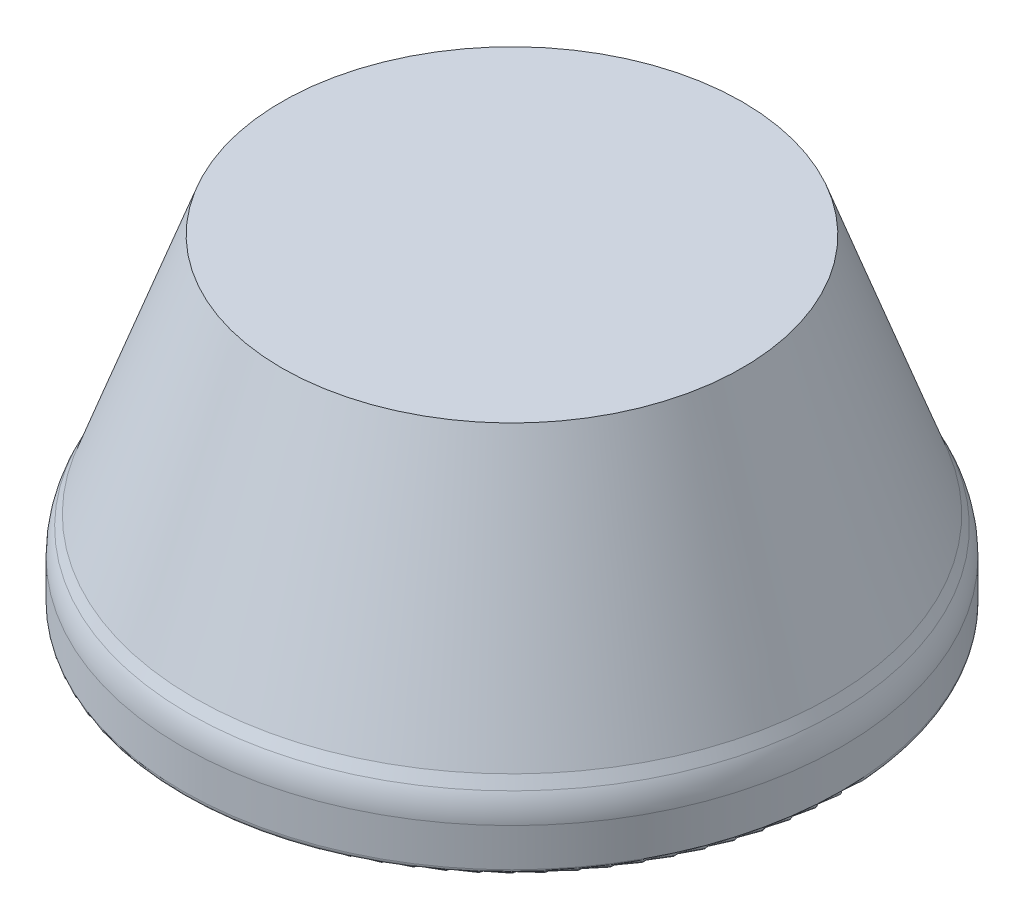
ISO-10303-21;
HEADER;
FILE_DESCRIPTION(('STEP AP214'),'2;1');
FILE_NAME('part.step','',(''),(''),'','','');
FILE_SCHEMA(('AUTOMOTIVE_DESIGN { 1 0 10303 214 1 1 1 1 }'));
ENDSEC;
DATA;
#1=APPLICATION_CONTEXT('core data for automotive mechanical design processes');
#2=APPLICATION_PROTOCOL_DEFINITION('international standard','automotive_design',2000,#1);
#3=PRODUCT_CONTEXT('',#1,'mechanical');
#4=PRODUCT('Part','Part','',(#3));
#5=PRODUCT_RELATED_PRODUCT_CATEGORY('part','',(#4));
#6=PRODUCT_DEFINITION_FORMATION('','',#4);
#7=PRODUCT_DEFINITION_CONTEXT('part definition',#1,'design');
#8=PRODUCT_DEFINITION('design','',#6,#7);
#9=PRODUCT_DEFINITION_SHAPE('','',#8);
#10=(LENGTH_UNIT() NAMED_UNIT(*) SI_UNIT(.MILLI.,.METRE.));
#11=(NAMED_UNIT(*) PLANE_ANGLE_UNIT() SI_UNIT($,.RADIAN.));
#12=(NAMED_UNIT(*) SI_UNIT($,.STERADIAN.) SOLID_ANGLE_UNIT());
#13=UNCERTAINTY_MEASURE_WITH_UNIT(LENGTH_MEASURE(1.E-05),#10,'distance_accuracy_value','');
#14=(GEOMETRIC_REPRESENTATION_CONTEXT(3) GLOBAL_UNCERTAINTY_ASSIGNED_CONTEXT((#13)) GLOBAL_UNIT_ASSIGNED_CONTEXT((#10,
#11,#12)) REPRESENTATION_CONTEXT('',''));
#15=CARTESIAN_POINT('',(0.,0.,0.));
#16=DIRECTION('',(0.,0.,1.));
#17=DIRECTION('',(1.,0.,0.));
#18=AXIS2_PLACEMENT_3D('',#15,#16,#17);
#19=CARTESIAN_POINT('',(0.,23.,0.));
#20=DIRECTION('',(0.,-1.,0.));
#21=DIRECTION('',(0.,0.,-1.));
#22=AXIS2_PLACEMENT_3D('',#19,#20,#21);
#23=CONICAL_SURFACE('',#22,20.,0.347240782896111);
#24=CARTESIAN_POINT('',(0.,2.,0.));
#25=DIRECTION('',(0.,1.,0.));
#26=DIRECTION('',(0.,0.,1.));
#27=AXIS2_PLACEMENT_3D('',#24,#25,#26);
#28=CIRCLE('',#27,27.6);
#29=CARTESIAN_POINT('',(0.,2.,27.6));
#30=VERTEX_POINT('',#29);
#31=EDGE_CURVE('E129',#30,#30,#28,.T.);
#32=ORIENTED_EDGE('',*,*,#31,.T.);
#33=EDGE_LOOP('',(#32));
#34=FACE_BOUND('',#33,.T.);
#35=CARTESIAN_POINT('',(0.,23.,0.));
#36=DIRECTION('',(0.,1.,0.));
#37=DIRECTION('',(0.,0.,1.));
#38=AXIS2_PLACEMENT_3D('',#35,#36,#37);
#39=CIRCLE('',#38,20.);
#40=CARTESIAN_POINT('',(0.,23.,20.));
#41=VERTEX_POINT('',#40);
#42=EDGE_CURVE('E63',#41,#41,#39,.T.);
#43=ORIENTED_EDGE('',*,*,#42,.F.);
#44=EDGE_LOOP('',(#43));
#45=FACE_BOUND('',#44,.T.);
#46=ADVANCED_FACE('F39',(#34,#45),#23,.T.);
#47=CARTESIAN_POINT('',(0.,23.,0.));
#48=DIRECTION('',(0.,1.,0.));
#49=DIRECTION('',(0.,0.,1.));
#50=AXIS2_PLACEMENT_3D('',#47,#48,#49);
#51=PLANE('',#50);
#52=ORIENTED_EDGE('',*,*,#42,.T.);
#53=EDGE_LOOP('',(#52));
#54=FACE_BOUND('',#53,.T.);
#55=ADVANCED_FACE('F82',(#54),#51,.T.);
#56=CARTESIAN_POINT('',(0.,0.,0.));
#57=DIRECTION('',(0.,1.,0.));
#58=DIRECTION('',(0.,0.,1.));
#59=AXIS2_PLACEMENT_3D('',#56,#57,#58);
#60=PLANE('',#59);
#61=CARTESIAN_POINT('',(0.,0.,0.));
#62=DIRECTION('',(0.,1.,0.));
#63=DIRECTION('',(0.,0.,1.));
#64=AXIS2_PLACEMENT_3D('',#61,#62,#63);
#65=CIRCLE('',#64,27.6);
#66=CARTESIAN_POINT('',(0.,0.,27.6));
#67=VERTEX_POINT('',#66);
#68=EDGE_CURVE('E66',#67,#67,#65,.T.);
#69=ORIENTED_EDGE('',*,*,#68,.F.);
#70=EDGE_LOOP('',(#69));
#71=FACE_BOUND('',#70,.T.);
#72=CARTESIAN_POINT('',(0.,0.,0.));
#73=DIRECTION('',(0.,1.,0.));
#74=DIRECTION('',(0.,0.,1.));
#75=AXIS2_PLACEMENT_3D('',#72,#73,#74);
#76=CIRCLE('',#75,26.);
#77=CARTESIAN_POINT('',(0.,0.,26.));
#78=VERTEX_POINT('',#77);
#79=EDGE_CURVE('E136',#78,#78,#76,.T.);
#80=ORIENTED_EDGE('',*,*,#79,.T.);
#81=EDGE_LOOP('',(#80));
#82=FACE_BOUND('',#81,.T.);
#83=ADVANCED_FACE('F88',(#71,#82),#60,.F.);
#84=CARTESIAN_POINT('',(0.,-5.,0.));
#85=DIRECTION('',(0.,1.,0.));
#86=DIRECTION('',(0.,0.,1.));
#87=AXIS2_PLACEMENT_3D('',#84,#85,#86);
#88=CYLINDRICAL_SURFACE('',#87,27.6);
#89=CARTESIAN_POINT('',(0.,-4.5,0.));
#90=DIRECTION('',(0.,1.,0.));
#91=DIRECTION('',(0.,0.,1.));
#92=AXIS2_PLACEMENT_3D('',#89,#90,#91);
#93=CIRCLE('',#92,27.6);
#94=CARTESIAN_POINT('',(0.,-4.5,27.6));
#95=VERTEX_POINT('',#94);
#96=EDGE_CURVE('E50',#95,#95,#93,.F.);
#97=ORIENTED_EDGE('',*,*,#96,.T.);
#98=EDGE_LOOP('',(#97));
#99=FACE_BOUND('',#98,.T.);
#100=ORIENTED_EDGE('',*,*,#68,.T.);
#101=EDGE_LOOP('',(#100));
#102=FACE_BOUND('',#101,.T.);
#103=ADVANCED_FACE('F84',(#99,#102),#88,.F.);
#104=CARTESIAN_POINT('',(0.,-5.,0.));
#105=DIRECTION('',(0.,1.,0.));
#106=DIRECTION('',(0.,0.,1.));
#107=AXIS2_PLACEMENT_3D('',#104,#105,#106);
#108=CYLINDRICAL_SURFACE('',#107,28.6);
#109=CARTESIAN_POINT('',(0.,-1.18033988749894,0.));
#110=DIRECTION('',(0.,-1.,0.));
#111=DIRECTION('',(0.,0.,-1.));
#112=AXIS2_PLACEMENT_3D('',#109,#110,#111);
#113=CIRCLE('',#112,28.6);
#114=CARTESIAN_POINT('',(0.,-1.18033988749894,-28.6));
#115=VERTEX_POINT('',#114);
#116=EDGE_CURVE('E11',#115,#115,#113,.T.);
#117=ORIENTED_EDGE('',*,*,#116,.T.);
#118=EDGE_LOOP('',(#117));
#119=FACE_BOUND('',#118,.T.);
#120=CARTESIAN_POINT('',(0.,-4.5,0.));
#121=DIRECTION('',(0.,1.,0.));
#122=DIRECTION('',(0.,0.,1.));
#123=AXIS2_PLACEMENT_3D('',#120,#121,#122);
#124=CIRCLE('',#123,28.6);
#125=CARTESIAN_POINT('',(0.,-4.5,28.6));
#126=VERTEX_POINT('',#125);
#127=EDGE_CURVE('E54',#126,#126,#124,.T.);
#128=ORIENTED_EDGE('',*,*,#127,.T.);
#129=EDGE_LOOP('',(#128));
#130=FACE_BOUND('',#129,.T.);
#131=ADVANCED_FACE('F109',(#119,#130),#108,.T.);
#132=CARTESIAN_POINT('',(0.,2.,0.));
#133=DIRECTION('',(0.,-1.,0.));
#134=DIRECTION('',(0.,0.,-1.));
#135=AXIS2_PLACEMENT_3D('',#132,#133,#134);
#136=CONICAL_SURFACE('',#135,27.6,0.463647609000805);
#137=CARTESIAN_POINT('',(0.,1.05572809000084,0.));
#138=DIRECTION('',(0.,1.,0.));
#139=DIRECTION('',(0.,0.,1.));
#140=AXIS2_PLACEMENT_3D('',#137,#138,#139);
#141=CIRCLE('',#140,28.0721359549996);
#142=CARTESIAN_POINT('',(0.,1.05572809000084,28.0721359549996));
#143=VERTEX_POINT('',#142);
#144=EDGE_CURVE('E46',#143,#143,#141,.T.);
#145=ORIENTED_EDGE('',*,*,#144,.T.);
#146=EDGE_LOOP('',(#145));
#147=FACE_BOUND('',#146,.T.);
#148=ORIENTED_EDGE('',*,*,#31,.F.);
#149=EDGE_LOOP('',(#148));
#150=FACE_BOUND('',#149,.T.);
#151=ADVANCED_FACE('F111',(#147,#150),#136,.T.);
#152=CARTESIAN_POINT('',(0.,4.5,0.));
#153=DIRECTION('',(0.,-1.,0.));
#154=DIRECTION('',(0.,0.,-1.));
#155=AXIS2_PLACEMENT_3D('',#152,#153,#154);
#156=CYLINDRICAL_SURFACE('',#155,26.);
#157=CARTESIAN_POINT('',(0.,2.,0.));
#158=DIRECTION('',(0.,1.,0.));
#159=DIRECTION('',(0.,0.,1.));
#160=AXIS2_PLACEMENT_3D('',#157,#158,#159);
#161=CIRCLE('',#160,26.);
#162=CARTESIAN_POINT('',(0.,2.,26.));
#163=VERTEX_POINT('',#162);
#164=EDGE_CURVE('E147',#163,#163,#161,.T.);
#165=ORIENTED_EDGE('',*,*,#164,.T.);
#166=EDGE_LOOP('',(#165));
#167=FACE_BOUND('',#166,.T.);
#168=ORIENTED_EDGE('',*,*,#79,.F.);
#169=EDGE_LOOP('',(#168));
#170=FACE_BOUND('',#169,.T.);
#171=ADVANCED_FACE('F116',(#167,#170),#156,.F.);
#172=CARTESIAN_POINT('',(0.,22.,0.));
#173=DIRECTION('',(0.,-1.,0.));
#174=DIRECTION('',(0.,0.,-1.));
#175=AXIS2_PLACEMENT_3D('',#172,#173,#174);
#176=CONICAL_SURFACE('',#175,19.,0.336674819386727);
#177=ORIENTED_EDGE('',*,*,#164,.F.);
#178=EDGE_LOOP('',(#177));
#179=FACE_BOUND('',#178,.T.);
#180=CARTESIAN_POINT('',(0.,22.,0.));
#181=DIRECTION('',(0.,1.,0.));
#182=DIRECTION('',(0.,0.,1.));
#183=AXIS2_PLACEMENT_3D('',#180,#181,#182);
#184=CIRCLE('',#183,19.);
#185=CARTESIAN_POINT('',(0.,22.,19.));
#186=VERTEX_POINT('',#185);
#187=EDGE_CURVE('E59',#186,#186,#184,.T.);
#188=ORIENTED_EDGE('',*,*,#187,.T.);
#189=EDGE_LOOP('',(#188));
#190=FACE_BOUND('',#189,.T.);
#191=ADVANCED_FACE('F100',(#179,#190),#176,.F.);
#192=CARTESIAN_POINT('',(-19.,22.,0.));
#193=DIRECTION('',(0.,1.,0.));
#194=DIRECTION('',(0.,0.,1.));
#195=AXIS2_PLACEMENT_3D('',#192,#193,#194);
#196=PLANE('',#195);
#197=ORIENTED_EDGE('',*,*,#187,.F.);
#198=EDGE_LOOP('',(#197));
#199=FACE_BOUND('',#198,.T.);
#200=ADVANCED_FACE('F95',(#199),#196,.F.);
#201=CARTESIAN_POINT('',(0.,-4.5,0.));
#202=DIRECTION('',(0.,1.,0.));
#203=DIRECTION('',(0.,0.,1.));
#204=AXIS2_PLACEMENT_3D('',#201,#202,#203);
#205=TOROIDAL_SURFACE('',#204,28.1,0.5);
#206=ORIENTED_EDGE('',*,*,#96,.F.);
#207=EDGE_LOOP('',(#206));
#208=FACE_BOUND('',#207,.T.);
#209=CARTESIAN_POINT('',(0.,-5.,0.));
#210=DIRECTION('',(0.,1.,0.));
#211=DIRECTION('',(0.,0.,1.));
#212=AXIS2_PLACEMENT_3D('',#209,#210,#211);
#213=CIRCLE('',#212,28.1);
#214=CARTESIAN_POINT('',(0.,-5.,28.1));
#215=VERTEX_POINT('',#214);
#216=EDGE_CURVE('E57',#215,#215,#213,.T.);
#217=ORIENTED_EDGE('',*,*,#216,.F.);
#218=EDGE_LOOP('',(#217));
#219=FACE_BOUND('',#218,.T.);
#220=ADVANCED_FACE('F92',(#208,#219),#205,.T.);
#221=CARTESIAN_POINT('',(0.,-4.5,0.));
#222=DIRECTION('',(0.,1.,0.));
#223=DIRECTION('',(0.,0.,1.));
#224=AXIS2_PLACEMENT_3D('',#221,#222,#223);
#225=TOROIDAL_SURFACE('',#224,28.1,0.5);
#226=ORIENTED_EDGE('',*,*,#216,.T.);
#227=EDGE_LOOP('',(#226));
#228=FACE_BOUND('',#227,.T.);
#229=ORIENTED_EDGE('',*,*,#127,.F.);
#230=EDGE_LOOP('',(#229));
#231=FACE_BOUND('',#230,.T.);
#232=ADVANCED_FACE('F90',(#228,#231),#225,.T.);
#233=CARTESIAN_POINT('',(0.,-1.18033988749894,0.));
#234=DIRECTION('',(0.,-1.,0.));
#235=DIRECTION('',(0.,0.,-1.));
#236=AXIS2_PLACEMENT_3D('',#233,#234,#235);
#237=TOROIDAL_SURFACE('',#236,23.6,5.);
#238=ORIENTED_EDGE('',*,*,#116,.F.);
#239=EDGE_LOOP('',(#238));
#240=FACE_BOUND('',#239,.T.);
#241=ORIENTED_EDGE('',*,*,#144,.F.);
#242=EDGE_LOOP('',(#241));
#243=FACE_BOUND('',#242,.T.);
#244=ADVANCED_FACE('F41',(#240,#243),#237,.T.);
#245=CLOSED_SHELL('',(#46,#55,#83,#103,#131,#151,#171,#191,#200,#220,#232,#244));
#246=MANIFOLD_SOLID_BREP('B2',#245);
#247=ADVANCED_BREP_SHAPE_REPRESENTATION('',(#18,#246),#14);
#248=SHAPE_DEFINITION_REPRESENTATION(#9,#247);
ENDSEC;
END-ISO-10303-21;
